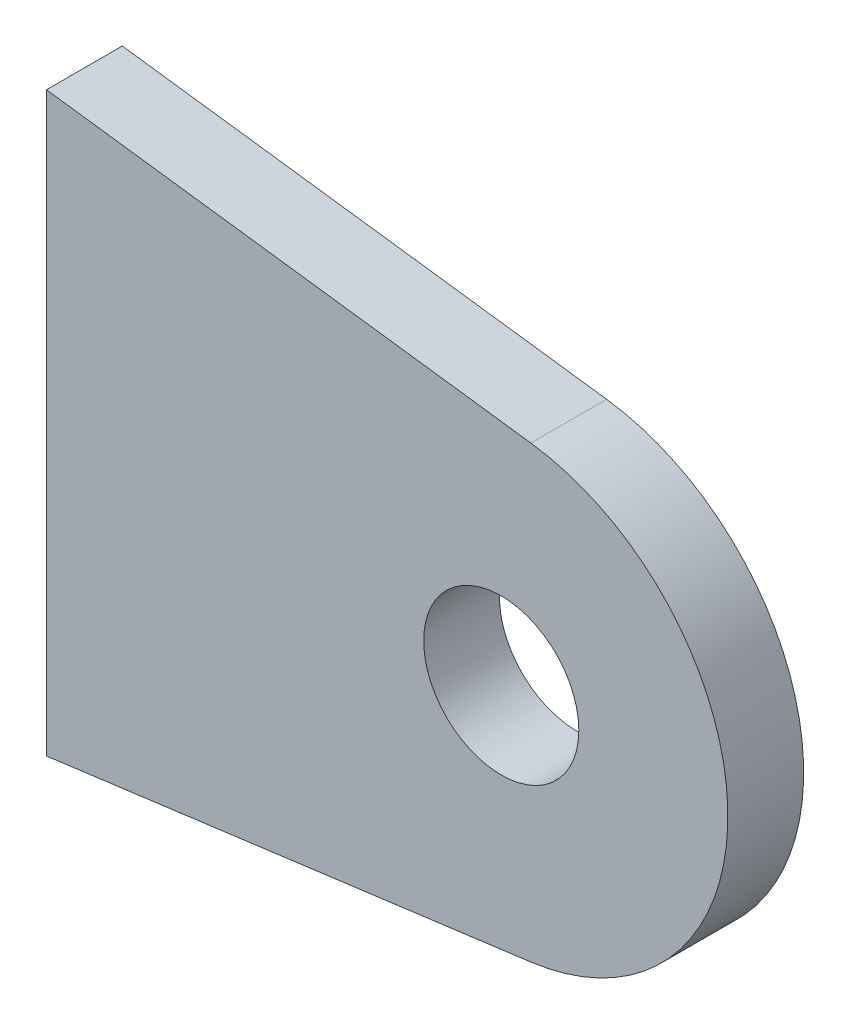
ISO-10303-21;
HEADER;
FILE_DESCRIPTION(('STEP AP214'),'2;1');
FILE_NAME('part.step','',(''),(''),'','','');
FILE_SCHEMA(('AUTOMOTIVE_DESIGN { 1 0 10303 214 1 1 1 1 }'));
ENDSEC;
DATA;
#1=APPLICATION_CONTEXT('core data for automotive mechanical design processes');
#2=APPLICATION_PROTOCOL_DEFINITION('international standard','automotive_design',2000,#1);
#3=PRODUCT_CONTEXT('',#1,'mechanical');
#4=PRODUCT('Part','Part','',(#3));
#5=PRODUCT_RELATED_PRODUCT_CATEGORY('part','',(#4));
#6=PRODUCT_DEFINITION_FORMATION('','',#4);
#7=PRODUCT_DEFINITION_CONTEXT('part definition',#1,'design');
#8=PRODUCT_DEFINITION('design','',#6,#7);
#9=PRODUCT_DEFINITION_SHAPE('','',#8);
#10=(LENGTH_UNIT() NAMED_UNIT(*) SI_UNIT(.MILLI.,.METRE.));
#11=(NAMED_UNIT(*) PLANE_ANGLE_UNIT() SI_UNIT($,.RADIAN.));
#12=(NAMED_UNIT(*) SI_UNIT($,.STERADIAN.) SOLID_ANGLE_UNIT());
#13=UNCERTAINTY_MEASURE_WITH_UNIT(LENGTH_MEASURE(1.E-05),#10,'distance_accuracy_value','');
#14=(GEOMETRIC_REPRESENTATION_CONTEXT(3) GLOBAL_UNCERTAINTY_ASSIGNED_CONTEXT((#13)) GLOBAL_UNIT_ASSIGNED_CONTEXT((#10,
#11,#12)) REPRESENTATION_CONTEXT('',''));
#15=CARTESIAN_POINT('',(0.,0.,0.));
#16=DIRECTION('',(0.,0.,1.));
#17=DIRECTION('',(1.,0.,0.));
#18=AXIS2_PLACEMENT_3D('',#15,#16,#17);
#19=CARTESIAN_POINT('',(1.23946787290706,-9.41469319322447,3.17499999999981));
#20=DIRECTION('',(0.130526192220052,-0.99144486137381,0.));
#21=DIRECTION('',(0.99144486137381,0.130526192220052,0.));
#22=AXIS2_PLACEMENT_3D('',#19,#20,#21);
#23=PLANE('',#22);
#24=DIRECTION('',(-0.99144486137381,-0.130526192220052,0.));
#25=VECTOR('',#24,1.);
#26=CARTESIAN_POINT('',(1.23946787290706,-9.41469319322447,-1.94289029309402E-13));
#27=LINE('',#26,#25);
#28=CARTESIAN_POINT('',(1.23946787290707,-9.41469319322442,-1.94289029309402E-13));
#29=VERTEX_POINT('',#28);
#30=CARTESIAN_POINT('',(-19.05,-12.0858523134119,-1.94289029309402E-13));
#31=VERTEX_POINT('',#30);
#32=EDGE_CURVE('E108',#29,#31,#27,.T.);
#33=ORIENTED_EDGE('',*,*,#32,.F.);
#34=DIRECTION('',(0.,0.,-1.));
#35=VECTOR('',#34,1.);
#36=CARTESIAN_POINT('',(1.23946787290707,-9.41469319322442,3.17499999999981));
#37=LINE('',#36,#35);
#38=CARTESIAN_POINT('',(1.23946787290707,-9.41469319322442,3.17499999999981));
#39=VERTEX_POINT('',#38);
#40=EDGE_CURVE('E11',#39,#29,#37,.T.);
#41=ORIENTED_EDGE('',*,*,#40,.F.);
#42=DIRECTION('',(-0.99144486137381,-0.130526192220052,0.));
#43=VECTOR('',#42,1.);
#44=CARTESIAN_POINT('',(1.23946787290706,-9.41469319322447,3.17499999999981));
#45=LINE('',#44,#43);
#46=CARTESIAN_POINT('',(-19.05,-12.0858523134119,3.17499999999981));
#47=VERTEX_POINT('',#46);
#48=EDGE_CURVE('E90',#39,#47,#45,.T.);
#49=ORIENTED_EDGE('',*,*,#48,.T.);
#50=DIRECTION('',(0.,0.,-1.));
#51=VECTOR('',#50,1.);
#52=CARTESIAN_POINT('',(-19.05,-12.0858523134119,3.17499999999981));
#53=LINE('',#52,#51);
#54=EDGE_CURVE('E57',#47,#31,#53,.T.);
#55=ORIENTED_EDGE('',*,*,#54,.T.);
#56=EDGE_LOOP('',(#33,#41,#49,#55));
#57=FACE_BOUND('',#56,.T.);
#58=ADVANCED_FACE('F41',(#57),#23,.T.);
#59=CARTESIAN_POINT('',(0.,0.,3.17499999999981));
#60=DIRECTION('',(0.,0.,-1.));
#61=DIRECTION('',(-1.,0.,0.));
#62=AXIS2_PLACEMENT_3D('',#59,#60,#61);
#63=CYLINDRICAL_SURFACE('',#62,9.49593220966295);
#64=CARTESIAN_POINT('',(0.,0.,-1.94289029309402E-13));
#65=DIRECTION('',(0.,0.,1.));
#66=DIRECTION('',(1.,0.,0.));
#67=AXIS2_PLACEMENT_3D('',#64,#65,#66);
#68=CIRCLE('',#67,9.49593220966295);
#69=CARTESIAN_POINT('',(1.23946787290707,9.41469319322442,-1.94289029309402E-13));
#70=VERTEX_POINT('',#69);
#71=EDGE_CURVE('E96',#29,#70,#68,.T.);
#72=ORIENTED_EDGE('',*,*,#71,.T.);
#73=DIRECTION('',(0.,0.,-1.));
#74=VECTOR('',#73,1.);
#75=CARTESIAN_POINT('',(1.23946787290707,9.41469319322442,3.17499999999981));
#76=LINE('',#75,#74);
#77=CARTESIAN_POINT('',(1.23946787290707,9.41469319322442,3.17499999999981));
#78=VERTEX_POINT('',#77);
#79=EDGE_CURVE('E49',#78,#70,#76,.T.);
#80=ORIENTED_EDGE('',*,*,#79,.F.);
#81=CARTESIAN_POINT('',(0.,0.,3.17499999999981));
#82=DIRECTION('',(0.,0.,1.));
#83=DIRECTION('',(1.,0.,0.));
#84=AXIS2_PLACEMENT_3D('',#81,#82,#83);
#85=CIRCLE('',#84,9.49593220966295);
#86=EDGE_CURVE('E83',#39,#78,#85,.T.);
#87=ORIENTED_EDGE('',*,*,#86,.F.);
#88=ORIENTED_EDGE('',*,*,#40,.T.);
#89=EDGE_LOOP('',(#72,#80,#87,#88));
#90=FACE_BOUND('',#89,.T.);
#91=ADVANCED_FACE('F94',(#90),#63,.T.);
#92=CARTESIAN_POINT('',(1.23946787290707,9.41469319322445,3.17499999999981));
#93=DIRECTION('',(-0.130526192220054,-0.99144486137381,0.));
#94=DIRECTION('',(0.99144486137381,-0.130526192220054,0.));
#95=AXIS2_PLACEMENT_3D('',#92,#93,#94);
#96=PLANE('',#95);
#97=DIRECTION('',(-0.99144486137381,0.130526192220054,0.));
#98=VECTOR('',#97,1.);
#99=CARTESIAN_POINT('',(1.23946787290707,9.41469319322445,-1.94289029309402E-13));
#100=LINE('',#99,#98);
#101=CARTESIAN_POINT('',(-19.05,12.0858523134119,-1.94289029309402E-13));
#102=VERTEX_POINT('',#101);
#103=EDGE_CURVE('E111',#70,#102,#100,.T.);
#104=ORIENTED_EDGE('',*,*,#103,.T.);
#105=DIRECTION('',(0.,0.,-1.));
#106=VECTOR('',#105,1.);
#107=CARTESIAN_POINT('',(-19.05,12.0858523134119,3.17499999999981));
#108=LINE('',#107,#106);
#109=CARTESIAN_POINT('',(-19.05,12.0858523134119,3.17499999999981));
#110=VERTEX_POINT('',#109);
#111=EDGE_CURVE('E71',#110,#102,#108,.T.);
#112=ORIENTED_EDGE('',*,*,#111,.F.);
#113=DIRECTION('',(-0.99144486137381,0.130526192220054,0.));
#114=VECTOR('',#113,1.);
#115=CARTESIAN_POINT('',(1.23946787290707,9.41469319322445,3.17499999999981));
#116=LINE('',#115,#114);
#117=EDGE_CURVE('E89',#78,#110,#116,.T.);
#118=ORIENTED_EDGE('',*,*,#117,.F.);
#119=ORIENTED_EDGE('',*,*,#79,.T.);
#120=EDGE_LOOP('',(#104,#112,#118,#119));
#121=FACE_BOUND('',#120,.T.);
#122=ADVANCED_FACE('F99',(#121),#96,.F.);
#123=CARTESIAN_POINT('',(-19.05,0.,3.17499999999981));
#124=DIRECTION('',(-1.,0.,0.));
#125=DIRECTION('',(0.,0.,1.));
#126=AXIS2_PLACEMENT_3D('',#123,#124,#125);
#127=PLANE('',#126);
#128=DIRECTION('',(0.,1.,0.));
#129=VECTOR('',#128,1.);
#130=CARTESIAN_POINT('',(-19.05,0.,-1.94289029309402E-13));
#131=LINE('',#130,#129);
#132=EDGE_CURVE('E113',#31,#102,#131,.T.);
#133=ORIENTED_EDGE('',*,*,#132,.F.);
#134=ORIENTED_EDGE('',*,*,#54,.F.);
#135=DIRECTION('',(0.,1.,0.));
#136=VECTOR('',#135,1.);
#137=CARTESIAN_POINT('',(-19.05,0.,3.17499999999981));
#138=LINE('',#137,#136);
#139=EDGE_CURVE('E100',#47,#110,#138,.T.);
#140=ORIENTED_EDGE('',*,*,#139,.T.);
#141=ORIENTED_EDGE('',*,*,#111,.T.);
#142=EDGE_LOOP('',(#133,#134,#140,#141));
#143=FACE_BOUND('',#142,.T.);
#144=ADVANCED_FACE('F122',(#143),#127,.T.);
#145=CARTESIAN_POINT('',(0.,0.,3.17499999999981));
#146=DIRECTION('',(0.,0.,-1.));
#147=DIRECTION('',(-1.,0.,0.));
#148=AXIS2_PLACEMENT_3D('',#145,#146,#147);
#149=CYLINDRICAL_SURFACE('',#148,3.24999999999995);
#150=CARTESIAN_POINT('',(0.,0.,3.17499999999981));
#151=DIRECTION('',(0.,0.,1.));
#152=DIRECTION('',(1.,0.,0.));
#153=AXIS2_PLACEMENT_3D('',#150,#151,#152);
#154=CIRCLE('',#153,3.24999999999995);
#155=CARTESIAN_POINT('',(3.24999999999995,0.,3.17499999999981));
#156=VERTEX_POINT('',#155);
#157=EDGE_CURVE('E102',#156,#156,#154,.T.);
#158=ORIENTED_EDGE('',*,*,#157,.T.);
#159=EDGE_LOOP('',(#158));
#160=FACE_BOUND('',#159,.T.);
#161=CARTESIAN_POINT('',(0.,0.,-1.94289029309402E-13));
#162=DIRECTION('',(0.,0.,1.));
#163=DIRECTION('',(1.,0.,0.));
#164=AXIS2_PLACEMENT_3D('',#161,#162,#163);
#165=CIRCLE('',#164,3.24999999999995);
#166=CARTESIAN_POINT('',(3.24999999999995,0.,-1.94289029309402E-13));
#167=VERTEX_POINT('',#166);
#168=EDGE_CURVE('E116',#167,#167,#165,.T.);
#169=ORIENTED_EDGE('',*,*,#168,.F.);
#170=EDGE_LOOP('',(#169));
#171=FACE_BOUND('',#170,.T.);
#172=ADVANCED_FACE('F124',(#160,#171),#149,.F.);
#173=CARTESIAN_POINT('',(0.,0.,3.17499999999981));
#174=DIRECTION('',(0.,0.,1.));
#175=DIRECTION('',(1.,0.,0.));
#176=AXIS2_PLACEMENT_3D('',#173,#174,#175);
#177=PLANE('',#176);
#178=ORIENTED_EDGE('',*,*,#48,.F.);
#179=ORIENTED_EDGE('',*,*,#86,.T.);
#180=ORIENTED_EDGE('',*,*,#117,.T.);
#181=ORIENTED_EDGE('',*,*,#139,.F.);
#182=EDGE_LOOP('',(#178,#179,#180,#181));
#183=FACE_BOUND('',#182,.T.);
#184=ORIENTED_EDGE('',*,*,#157,.F.);
#185=EDGE_LOOP('',(#184));
#186=FACE_BOUND('',#185,.T.);
#187=ADVANCED_FACE('F85',(#183,#186),#177,.T.);
#188=CARTESIAN_POINT('',(0.,0.,-1.94289029309402E-13));
#189=DIRECTION('',(0.,0.,1.));
#190=DIRECTION('',(1.,0.,0.));
#191=AXIS2_PLACEMENT_3D('',#188,#189,#190);
#192=PLANE('',#191);
#193=ORIENTED_EDGE('',*,*,#32,.T.);
#194=ORIENTED_EDGE('',*,*,#132,.T.);
#195=ORIENTED_EDGE('',*,*,#103,.F.);
#196=ORIENTED_EDGE('',*,*,#71,.F.);
#197=EDGE_LOOP('',(#193,#194,#195,#196));
#198=FACE_BOUND('',#197,.T.);
#199=ORIENTED_EDGE('',*,*,#168,.T.);
#200=EDGE_LOOP('',(#199));
#201=FACE_BOUND('',#200,.T.);
#202=ADVANCED_FACE('F156',(#198,#201),#192,.F.);
#203=CLOSED_SHELL('',(#58,#91,#122,#144,#172,#187,#202));
#204=MANIFOLD_SOLID_BREP('B2',#203);
#205=ADVANCED_BREP_SHAPE_REPRESENTATION('',(#18,#204),#14);
#206=SHAPE_DEFINITION_REPRESENTATION(#9,#205);
ENDSEC;
END-ISO-10303-21;
